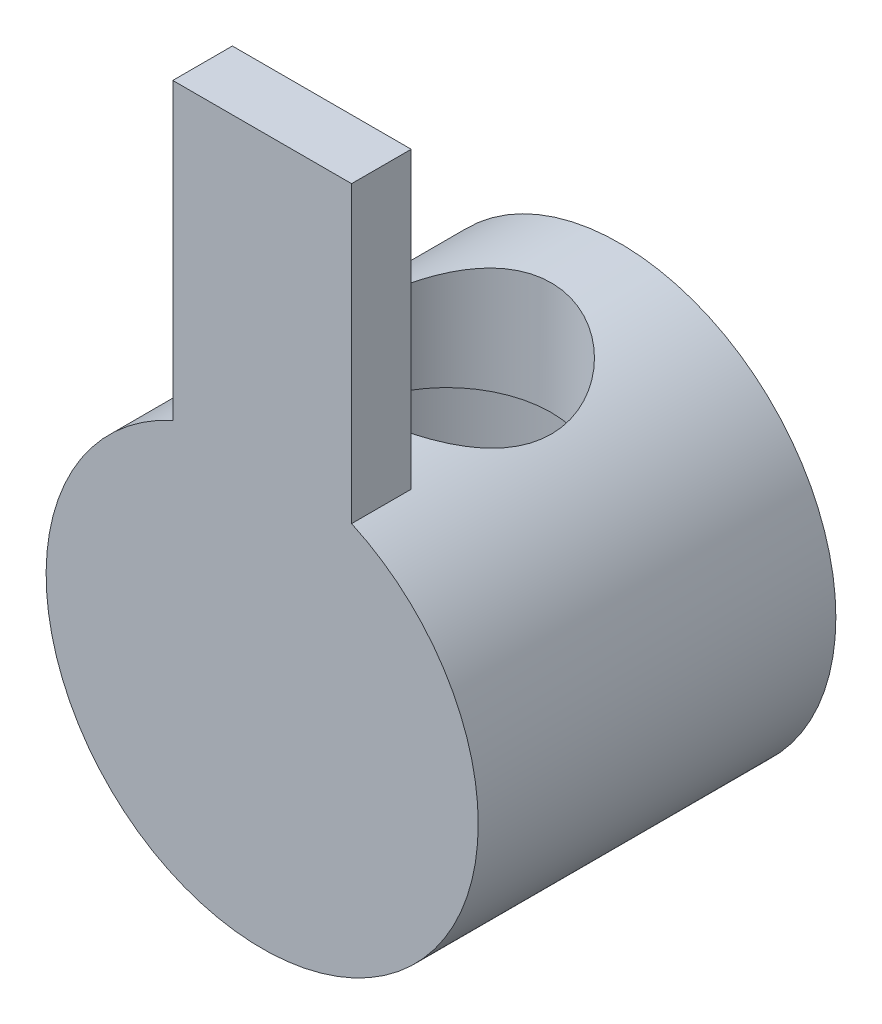
ISO-10303-21;
HEADER;
FILE_DESCRIPTION(('STEP AP214'),'2;1');
FILE_NAME('part.step','',(''),(''),'','','');
FILE_SCHEMA(('AUTOMOTIVE_DESIGN { 1 0 10303 214 1 1 1 1 }'));
ENDSEC;
DATA;
#1=APPLICATION_CONTEXT('core data for automotive mechanical design processes');
#2=APPLICATION_PROTOCOL_DEFINITION('international standard','automotive_design',2000,#1);
#3=PRODUCT_CONTEXT('',#1,'mechanical');
#4=PRODUCT('Part','Part','',(#3));
#5=PRODUCT_RELATED_PRODUCT_CATEGORY('part','',(#4));
#6=PRODUCT_DEFINITION_FORMATION('','',#4);
#7=PRODUCT_DEFINITION_CONTEXT('part definition',#1,'design');
#8=PRODUCT_DEFINITION('design','',#6,#7);
#9=PRODUCT_DEFINITION_SHAPE('','',#8);
#10=(LENGTH_UNIT() NAMED_UNIT(*) SI_UNIT(.MILLI.,.METRE.));
#11=(NAMED_UNIT(*) PLANE_ANGLE_UNIT() SI_UNIT($,.RADIAN.));
#12=(NAMED_UNIT(*) SI_UNIT($,.STERADIAN.) SOLID_ANGLE_UNIT());
#13=UNCERTAINTY_MEASURE_WITH_UNIT(LENGTH_MEASURE(1.E-05),#10,'distance_accuracy_value','');
#14=(GEOMETRIC_REPRESENTATION_CONTEXT(3) GLOBAL_UNCERTAINTY_ASSIGNED_CONTEXT((#13)) GLOBAL_UNIT_ASSIGNED_CONTEXT((#10,
#11,#12)) REPRESENTATION_CONTEXT('',''));
#15=CARTESIAN_POINT('',(0.,0.,0.));
#16=DIRECTION('',(0.,0.,1.));
#17=DIRECTION('',(1.,0.,0.));
#18=AXIS2_PLACEMENT_3D('',#15,#16,#17);
#19=CARTESIAN_POINT('',(0.,-4.98,-10.));
#20=DIRECTION('',(0.,0.,1.));
#21=DIRECTION('',(1.,0.,0.));
#22=AXIS2_PLACEMENT_3D('',#19,#20,#21);
#23=CYLINDRICAL_SURFACE('',#22,7.25);
#24=DIRECTION('',(0.,0.,1.));
#25=VECTOR('',#24,1.);
#26=CARTESIAN_POINT('',(3.,1.62018939122204,-10.));
#27=LINE('',#26,#25);
#28=CARTESIAN_POINT('',(3.,1.62018939122204,2.));
#29=VERTEX_POINT('',#28);
#30=CARTESIAN_POINT('',(3.,1.62018939122204,0.));
#31=VERTEX_POINT('',#30);
#32=EDGE_CURVE('E81',#29,#31,#27,.F.);
#33=ORIENTED_EDGE('',*,*,#32,.F.);
#34=CARTESIAN_POINT('',(0.,-4.98,2.));
#35=DIRECTION('',(0.,0.,1.));
#36=DIRECTION('',(1.,0.,0.));
#37=AXIS2_PLACEMENT_3D('',#34,#35,#36);
#38=CIRCLE('',#37,7.25);
#39=CARTESIAN_POINT('',(-3.,1.62018939122204,2.));
#40=VERTEX_POINT('',#39);
#41=EDGE_CURVE('E84',#40,#29,#38,.T.);
#42=ORIENTED_EDGE('',*,*,#41,.F.);
#43=DIRECTION('',(0.,0.,1.));
#44=VECTOR('',#43,1.);
#45=CARTESIAN_POINT('',(-3.,1.62018939122204,-10.));
#46=LINE('',#45,#44);
#47=CARTESIAN_POINT('',(-3.,1.62018939122204,0.));
#48=VERTEX_POINT('',#47);
#49=EDGE_CURVE('E87',#48,#40,#46,.T.);
#50=ORIENTED_EDGE('',*,*,#49,.F.);
#51=CARTESIAN_POINT('',(0.,-4.98,0.));
#52=DIRECTION('',(0.,0.,-1.));
#53=DIRECTION('',(-1.,0.,0.));
#54=AXIS2_PLACEMENT_3D('',#51,#52,#53);
#55=CIRCLE('',#54,7.25);
#56=EDGE_CURVE('E11',#48,#31,#55,.T.);
#57=ORIENTED_EDGE('',*,*,#56,.T.);
#58=EDGE_LOOP('',(#33,#42,#50,#57));
#59=FACE_BOUND('',#58,.T.);
#60=CARTESIAN_POINT('',(0.,-4.98,-10.));
#61=DIRECTION('',(0.,0.,1.));
#62=DIRECTION('',(1.,0.,0.));
#63=AXIS2_PLACEMENT_3D('',#60,#61,#62);
#64=CIRCLE('',#63,7.25);
#65=CARTESIAN_POINT('',(7.25,-4.98,-10.));
#66=VERTEX_POINT('',#65);
#67=EDGE_CURVE('E93',#66,#66,#64,.T.);
#68=ORIENTED_EDGE('',*,*,#67,.T.);
#69=EDGE_LOOP('',(#68));
#70=FACE_BOUND('',#69,.T.);
#71=CARTESIAN_POINT('',(0.,2.27,-0.7));
#72=CARTESIAN_POINT('',(0.0924197344090064,2.26999951625647,-0.700000562087777));
#73=CARTESIAN_POINT('',(0.184851700324278,2.26822836391737,-0.703665235258182));
#74=CARTESIAN_POINT('',(0.369038427453984,2.26118866138251,-0.718283050133746));
#75=CARTESIAN_POINT('',(0.460792842748421,2.2559184348274,-0.729239685325793));
#76=CARTESIAN_POINT('',(0.643048921020778,2.24200442372234,-0.758341536081696));
#77=CARTESIAN_POINT('',(0.733548377613047,2.23335532650045,-0.776498072888174));
#78=CARTESIAN_POINT('',(0.912511082504229,2.2129102642562,-0.819790567411884));
#79=CARTESIAN_POINT('',(1.00097348225918,2.20111301272506,-0.844929378641798));
#80=CARTESIAN_POINT('',(1.26165710014341,2.16152692403269,-0.930216880017036));
#81=CARTESIAN_POINT('',(1.43007650644369,2.12947059980974,-1.00038340120622));
#82=CARTESIAN_POINT('',(1.75243577391075,2.05696412991879,-1.16490605500397));
#83=CARTESIAN_POINT('',(1.90637743266883,2.0165150283227,-1.25925917911254));
#84=CARTESIAN_POINT('',(2.20549992600058,1.92825171152682,-1.47571056596515));
#85=CARTESIAN_POINT('',(2.34966743130444,1.88014767438869,-1.59909260993046));
#86=CARTESIAN_POINT('',(2.61616910656958,1.78301156085306,-1.86730144914759));
#87=CARTESIAN_POINT('',(2.73848784121281,1.73397885522262,-2.01214327378865));
#88=CARTESIAN_POINT('',(2.9665722803644,1.63652614436876,-2.33169393716601));
#89=CARTESIAN_POINT('',(3.07054593134531,1.58839685486165,-2.50779323550846));
#90=CARTESIAN_POINT('',(3.20280582467406,1.52437830169269,-2.78488481373494));
#91=CARTESIAN_POINT('',(3.24295215440778,1.50439584363518,-2.87944077638164));
#92=CARTESIAN_POINT('',(3.31494138858401,1.46789058534821,-3.07228793536087));
#93=CARTESIAN_POINT('',(3.34678905379882,1.45136580259861,-3.1705769528688));
#94=CARTESIAN_POINT('',(3.40019571444323,1.42328259591883,-3.36442134746372));
#95=CARTESIAN_POINT('',(3.42224035612938,1.41149354493502,-3.45980978773245));
#96=CARTESIAN_POINT('',(3.45829494118776,1.39205745108166,-3.65246585255564));
#97=CARTESIAN_POINT('',(3.47230901270318,1.38440828020448,-3.74973248498831));
#98=CARTESIAN_POINT('',(3.49210257020647,1.37356999069279,-3.94530559255865));
#99=CARTESIAN_POINT('',(3.49788626567557,1.37037859211603,-4.04361151020829));
#100=CARTESIAN_POINT('',(3.50115223830506,1.36857648409953,-4.24037117599865));
#101=CARTESIAN_POINT('',(3.49863521600532,1.36996538810471,-4.33882491096337));
#102=CARTESIAN_POINT('',(3.48011226982809,1.38015636914951,-4.61152040136846));
#103=CARTESIAN_POINT('',(3.45512748150764,1.39388960951479,-4.78506789227657));
#104=CARTESIAN_POINT('',(3.38005309921615,1.43400726185332,-5.125000475739));
#105=CARTESIAN_POINT('',(3.32995636440664,1.4603952722472,-5.29138351638671));
#106=CARTESIAN_POINT('',(3.20513883142098,1.52342689255621,-5.61711139319446));
#107=CARTESIAN_POINT('',(3.12987176899912,1.56029501900639,-5.77620209689284));
#108=CARTESIAN_POINT('',(2.95725477143714,1.64013394314775,-6.08022532401225));
#109=CARTESIAN_POINT('',(2.85989501281258,1.68310745240041,-6.22515150806254));
#110=CARTESIAN_POINT('',(2.6325387841291,1.77640631513003,-6.51461609579767));
#111=CARTESIAN_POINT('',(2.50005516991657,1.82700318262187,-6.65712032864966));
#112=CARTESIAN_POINT('',(2.21278698690098,1.92573246048187,-6.91870026481778));
#113=CARTESIAN_POINT('',(2.05799315338548,1.97386383570025,-7.03776618612366));
#114=CARTESIAN_POINT('',(1.72248977617807,2.06463582669973,-7.25358416530923));
#115=CARTESIAN_POINT('',(1.54098358591165,2.1069744439856,-7.34923491576218));
#116=CARTESIAN_POINT('',(1.16189027618242,2.17888365778159,-7.50789083805801));
#117=CARTESIAN_POINT('',(0.964315225712641,2.20846373361331,-7.57092025383579));
#118=CARTESIAN_POINT('',(0.575427178761533,2.24956137345064,-7.65765644097381));
#119=CARTESIAN_POINT('',(0.384851120965313,2.26232050167989,-7.68407465698647));
#120=CARTESIAN_POINT('',(0.0015704855468019,2.27252956279915,-7.70525137468312));
#121=CARTESIAN_POINT('',(-0.191133147335228,2.26998603783187,-7.70002340563987));
#122=CARTESIAN_POINT('',(-0.558652598555112,2.25062150468021,-7.65971802852813));
#123=CARTESIAN_POINT('',(-0.733765760668835,2.23482897947436,-7.62679038031963));
#124=CARTESIAN_POINT('',(-1.07566392597487,2.19183026494162,-7.53530723891361));
#125=CARTESIAN_POINT('',(-1.242447979602,2.16462277755391,-7.47674883106264));
#126=CARTESIAN_POINT('',(-1.56867622368486,2.10027110572829,-7.33399286309544));
#127=CARTESIAN_POINT('',(-1.72775279197647,2.06285459234176,-7.24908225496695));
#128=CARTESIAN_POINT('',(-2.02994882096989,1.98177602123535,-7.05681976053942));
#129=CARTESIAN_POINT('',(-2.1730612846635,1.93811124391574,-6.94945809282528));
#130=CARTESIAN_POINT('',(-2.45334289082279,1.84403400363376,-6.7037940074769));
#131=CARTESIAN_POINT('',(-2.58872429618118,1.79337154589652,-6.56354360610609));
#132=CARTESIAN_POINT('',(-2.8347732507603,1.69414400158029,-6.26202690872446));
#133=CARTESIAN_POINT('',(-2.94542653915999,1.6455801382248,-6.10074857025421));
#134=CARTESIAN_POINT('',(-3.14292960493586,1.55428079460178,-5.75352092992805));
#135=CARTESIAN_POINT('',(-3.22865771017454,1.51185391775164,-5.56684555333028));
#136=CARTESIAN_POINT('',(-3.36657111472758,1.44143212824369,-5.17899267852423));
#137=CARTESIAN_POINT('',(-3.41879657408118,1.41341994451633,-4.97783286607925));
#138=CARTESIAN_POINT('',(-3.48365513197375,1.37829256777328,-4.58687103552428));
#139=CARTESIAN_POINT('',(-3.4995294699332,1.36947053674869,-4.39776206708876));
#140=CARTESIAN_POINT('',(-3.50044930713568,1.3689662610773,-4.01947581699037));
#141=CARTESIAN_POINT('',(-3.48550545238527,1.37727809761231,-3.83029858148136));
#142=CARTESIAN_POINT('',(-3.42818880782964,1.40834281217462,-3.47376949844286));
#143=CARTESIAN_POINT('',(-3.38820164237417,1.42983661035602,-3.3059113385515));
#144=CARTESIAN_POINT('',(-3.28473991751539,1.48346331347726,-2.97941352118357));
#145=CARTESIAN_POINT('',(-3.22125814302187,1.5155994863239,-2.82077671287705));
#146=CARTESIAN_POINT('',(-3.06780407928735,1.58953439743495,-2.50549138276718));
#147=CARTESIAN_POINT('',(-2.97634033943088,1.63183673158473,-2.34969020960012));
#148=CARTESIAN_POINT('',(-2.77124491824015,1.72038561077047,-2.05465418369911));
#149=CARTESIAN_POINT('',(-2.65760223530799,1.76663410681855,-1.91542760800301));
#150=CARTESIAN_POINT('',(-2.39667306836182,1.86396969739019,-1.64156775285248));
#151=CARTESIAN_POINT('',(-2.2470582676029,1.91502783059325,-1.50913492652795));
#152=CARTESIAN_POINT('',(-1.926056329864,2.01148053226985,-1.27080150780442));
#153=CARTESIAN_POINT('',(-1.75465835424514,2.05687225887253,-1.16491420214408));
#154=CARTESIAN_POINT('',(-1.48449721372475,2.11699609149429,-1.02880360304943));
#155=CARTESIAN_POINT('',(-1.39219777976225,2.13572026326504,-0.987199236928428));
#156=CARTESIAN_POINT('',(-1.20384430533545,2.16999267078129,-0.91198808237127));
#157=CARTESIAN_POINT('',(-1.10779212819422,2.18554245939336,-0.878377382204291));
#158=CARTESIAN_POINT('',(-0.912870954342657,2.21297141660153,-0.819613908704564));
#159=CARTESIAN_POINT('',(-0.814008861622716,2.22485885382476,-0.794442071128671));
#160=CARTESIAN_POINT('',(-0.614125636788845,2.24463981626614,-0.752789738784914));
#161=CARTESIAN_POINT('',(-0.5131059248942,2.252535889133,-0.736303699672239));
#162=CARTESIAN_POINT('',(-0.343267758936794,2.26219170214062,-0.716196435736514));
#163=CARTESIAN_POINT('',(-0.274793917511191,2.26511573621254,-0.710126896599167));
#164=CARTESIAN_POINT('',(-0.137548980346633,2.26902008951613,-0.702028418909373));
#165=CARTESIAN_POINT('',(-0.0687778771955608,2.27000035999728,-0.699999581699684));
#166=CARTESIAN_POINT('',(0.,2.27,-0.7));
#167=B_SPLINE_CURVE_WITH_KNOTS('',3,(#71,#72,#73,#74,#75,#76,#77,#78,#79,#80,#81,#82,#83,#84,
#85,#86,#87,#88,#89,#90,#91,#92,#93,#94,#95,#96,#97,#98,#99,#100,#101,#102,#103,#104,#105,#106,
#107,#108,#109,#110,#111,#112,#113,#114,#115,#116,#117,#118,#119,#120,#121,#122,#123,#124,#125,
#126,#127,#128,#129,#130,#131,#132,#133,#134,#135,#136,#137,#138,#139,#140,#141,#142,#143,#144,
#145,#146,#147,#148,#149,#150,#151,#152,#153,#154,#155,#156,#157,#158,#159,#160,#161,#162,#163,
#164,#165,#166),.UNSPECIFIED.,.T.,.F.,(4,2,2,2,2,2,2,2,2,2,2,2,2,2,2,2,2,2,2,2,2,2,2,2,2,2,2,2,
2,2,2,2,2,2,2,2,2,2,2,2,2,2,2,2,2,2,2,4),(0.,0.277190779561934,0.554514453412982,
0.83227593574228,1.11015110095688,1.66318664600134,2.21615343394175,2.8009286038271,
3.38611527493435,4.01285329867772,4.32643963332247,4.6398456719221,4.93526187198635,
5.23052607575645,5.52563921031817,5.8207274394162,6.34564136107367,6.87070463211308,
7.40799529553673,7.94552533422464,8.5460232238765,9.14677120323059,9.77189266333227,
10.3965488682338,10.9718929174697,11.5469910148902,12.0811801575479,12.6154300623888,
13.1656248219585,13.7160597901317,14.3176383437117,14.9195629402578,15.5454259194192,
16.1705372599786,16.7372861445123,17.3038392809788,17.823253454085,18.3428272695145,
18.8972574932495,19.4519634376524,20.0678529685984,20.6840501559007,20.9925757557369,
21.3009500653111,21.6086229564098,21.9160992141535,22.1223767520317,22.3286594633851),.UNSPECIFIED.);
#168=CARTESIAN_POINT('',(0.,2.27,-0.7));
#169=VERTEX_POINT('',#168);
#170=EDGE_CURVE('E94',#169,#169,#167,.T.);
#171=ORIENTED_EDGE('',*,*,#170,.F.);
#172=EDGE_LOOP('',(#171));
#173=FACE_BOUND('',#172,.T.);
#174=CARTESIAN_POINT('',(0.,-12.23,-9.2));
#175=CARTESIAN_POINT('',(-0.124707365447508,-12.2300000045074,-9.20000000773032));
#176=CARTESIAN_POINT('',(-0.249414776255431,-12.2267755866717,-9.19532803208005));
#177=CARTESIAN_POINT('',(-0.497802636258185,-12.2139587226941,-9.17671619858997));
#178=CARTESIAN_POINT('',(-0.621483086411606,-12.2043662824969,-9.16277634940198));
#179=CARTESIAN_POINT('',(-0.866865548308617,-12.1790458782101,-9.12584430008295));
#180=CARTESIAN_POINT('',(-0.988567184643874,-12.1633167637351,-9.10285040266601));
#181=CARTESIAN_POINT('',(-1.22913749859048,-12.1260860830063,-9.04813856992388));
#182=CARTESIAN_POINT('',(-1.34800494028535,-12.1045820468356,-9.01641690161423));
#183=CARTESIAN_POINT('',(-1.58147202065318,-12.0564096502766,-8.94486780238016));
#184=CARTESIAN_POINT('',(-1.69609109811157,-12.0297695495095,-8.90508466870253));
#185=CARTESIAN_POINT('',(-1.9211343691283,-11.971800161077,-8.81777325860803));
#186=CARTESIAN_POINT('',(-2.03155690160736,-11.940469040355,-8.77024195387923));
#187=CARTESIAN_POINT('',(-2.35565955884968,-11.8403479439994,-8.61677793709575));
#188=CARTESIAN_POINT('',(-2.56237862225875,-11.7653865584404,-8.49991159700305));
#189=CARTESIAN_POINT('',(-2.97125505103695,-11.597197500727,-8.22951463512013));
#190=CARTESIAN_POINT('',(-3.17143802281698,-11.5029463961771,-8.07367361733959));
#191=CARTESIAN_POINT('',(-3.54473724377251,-11.3078508456777,-7.73530673963122));
#192=CARTESIAN_POINT('',(-3.71781266065275,-11.2069967715587,-7.55274140986908));
#193=CARTESIAN_POINT('',(-3.96913469199819,-11.0479954034937,-7.24426431264422));
#194=CARTESIAN_POINT('',(-4.05695763916772,-10.9894689311851,-7.12622470442001));
#195=CARTESIAN_POINT('',(-4.2222840113455,-10.8744866174718,-6.88217593257444));
#196=CARTESIAN_POINT('',(-4.29978486130115,-10.8180312952922,-6.75616479181688));
#197=CARTESIAN_POINT('',(-4.51579726807945,-10.654719820289,-6.36689769638949));
#198=CARTESIAN_POINT('',(-4.63832601468294,-10.5535808957307,-6.09178945926221));
#199=CARTESIAN_POINT('',(-4.80388310459135,-10.4107851954032,-5.60265965867914));
#200=CARTESIAN_POINT('',(-4.85975896940922,-10.360393969299,-5.39555722644186));
#201=CARTESIAN_POINT('',(-4.92350716410657,-10.3018770184824,-5.07792622458554));
#202=CARTESIAN_POINT('',(-4.94140929371512,-10.2852194466963,-4.97092839019408));
#203=CARTESIAN_POINT('',(-4.97026562385112,-10.2581968416857,-4.75523160758247));
#204=CARTESIAN_POINT('',(-4.98122242852199,-10.2478294500263,-4.64653331263163));
#205=CARTESIAN_POINT('',(-4.99602749686114,-10.2337903836384,-4.42762119138112));
#206=CARTESIAN_POINT('',(-4.99983666794842,-10.2301555326084,-4.31740233287728));
#207=CARTESIAN_POINT('',(-5.0001530395897,-10.2298542701958,-4.09694511047784));
#208=CARTESIAN_POINT('',(-4.99666024970233,-10.2331878496911,-3.98670674660796));
#209=CARTESIAN_POINT('',(-4.98243796743525,-10.2466790112805,-3.76707442613195));
#210=CARTESIAN_POINT('',(-4.97170547060903,-10.2568394264744,-3.65768083917566));
#211=CARTESIAN_POINT('',(-4.94320701136023,-10.2835438596528,-3.44058551295944));
#212=CARTESIAN_POINT('',(-4.92543809626122,-10.3000905574248,-3.33288450370312));
#213=CARTESIAN_POINT('',(-4.86451340017346,-10.3560548169202,-3.02605450855591));
#214=CARTESIAN_POINT('',(-4.81277867555868,-10.4027836482482,-2.8298934020129));
#215=CARTESIAN_POINT('',(-4.68769333563208,-10.5112581379366,-2.44904399621847));
#216=CARTESIAN_POINT('',(-4.61432572304214,-10.5730155978212,-2.26436485719988));
#217=CARTESIAN_POINT('',(-4.46840470952065,-10.6898459573366,-1.95157811584981));
#218=CARTESIAN_POINT('',(-4.40005317631329,-10.742851287919,-1.82069339943718));
#219=CARTESIAN_POINT('',(-4.25281227219442,-10.8523504521232,-1.56653096917303));
#220=CARTESIAN_POINT('',(-4.17392253897074,-10.9088444056508,-1.44325351707878));
#221=CARTESIAN_POINT('',(-4.00593581273484,-11.0236205617588,-1.20436285289545));
#222=CARTESIAN_POINT('',(-3.91681969378179,-11.0819059607594,-1.08876466179929));
#223=CARTESIAN_POINT('',(-3.72887194346622,-11.1985404349556,-0.865818409166073));
#224=CARTESIAN_POINT('',(-3.63004150124841,-11.2568895014949,-0.758469340701063));
#225=CARTESIAN_POINT('',(-3.4218883051479,-11.3727706168462,-0.551376341730058));
#226=CARTESIAN_POINT('',(-3.31246778607984,-11.4302880172784,-0.451722341042431));
#227=CARTESIAN_POINT('',(-3.08434050108664,-11.5424305202892,-0.261871233394489));
#228=CARTESIAN_POINT('',(-2.96563490843682,-11.5970559868388,-0.171672934957985));
#229=CARTESIAN_POINT('',(-2.71954034374921,-11.7019388180314,-0.00161554523004807));
#230=CARTESIAN_POINT('',(-2.59216637136548,-11.7522034021689,0.0782607459192534));
#231=CARTESIAN_POINT('',(-2.32914285665014,-11.8471043328957,0.226951226904318));
#232=CARTESIAN_POINT('',(-2.19349581809477,-11.8917423698946,0.295768740896106));
#233=CARTESIAN_POINT('',(-1.94566927113531,-11.9649603212021,0.407442707548162));
#234=CARTESIAN_POINT('',(-1.83495658100191,-11.9949060778806,0.452671987696643));
#235=CARTESIAN_POINT('',(-1.6095298562079,-12.0500331547583,0.535379630532579));
#236=CARTESIAN_POINT('',(-1.49481662261523,-12.0752154223831,0.572859534656766));
#237=CARTESIAN_POINT('',(-1.26203684055261,-12.1202950704758,0.639619801444246));
#238=CARTESIAN_POINT('',(-1.14397107904853,-12.1401936800512,0.668902071162937));
#239=CARTESIAN_POINT('',(-0.905273942577357,-12.1742688611479,0.718875758678831));
#240=CARTESIAN_POINT('',(-0.78464377915778,-12.1884480742079,0.739571142508974));
#241=CARTESIAN_POINT('',(-0.541127752731092,-12.2108154143192,0.772155755284704));
#242=CARTESIAN_POINT('',(-0.418234575698596,-12.2189782856484,0.784007863994002));
#243=CARTESIAN_POINT('',(-0.17169674252636,-12.2290160904699,0.798576022071974));
#244=CARTESIAN_POINT('',(-0.0480523896498806,-12.2308934118684,0.801295540950208));
#245=CARTESIAN_POINT('',(0.199056294653482,-12.228320284795,0.797564285119163));
#246=CARTESIAN_POINT('',(0.32252058436182,-12.2238685495391,0.791111645584437));
#247=CARTESIAN_POINT('',(0.568247670673675,-12.2087446186393,0.769135937470111));
#248=CARTESIAN_POINT('',(0.690510502841951,-12.1980726076915,0.753613138206834));
#249=CARTESIAN_POINT('',(0.925730861833421,-12.1715705583416,0.714913443309046));
#250=CARTESIAN_POINT('',(1.03881094618708,-12.1560830646101,0.692243758473169));
#251=CARTESIAN_POINT('',(1.26240501291379,-12.1201456680067,0.639375075066754));
#252=CARTESIAN_POINT('',(1.37291815204371,-12.0996941590238,0.609173639505344));
#253=CARTESIAN_POINT('',(1.69959635039116,-12.0314695519042,0.507787187362797));
#254=CARTESIAN_POINT('',(1.91108190736786,-11.9768050011065,0.425789468437276));
#255=CARTESIAN_POINT('',(2.33291296739471,-11.848215191033,0.228978067505943));
#256=CARTESIAN_POINT('',(2.54194687863821,-11.7731407406458,0.11214191008493));
#257=CARTESIAN_POINT('',(2.93827730674712,-11.6113571247276,-0.147505460295717));
#258=CARTESIAN_POINT('',(3.12555848770119,-11.5246398426238,-0.290334818823953));
#259=CARTESIAN_POINT('',(3.50648856741728,-11.3298185882529,-0.625178551572854));
#260=CARTESIAN_POINT('',(3.69583680364175,-11.2205808908297,-0.821426254116447));
#261=CARTESIAN_POINT('',(4.04065906969768,-11.0030495496867,-1.24243677948434));
#262=CARTESIAN_POINT('',(4.19611239689294,-10.8947565215053,-1.46721689773524));
#263=CARTESIAN_POINT('',(4.45377022577178,-10.7026807900615,-1.91475363301554));
#264=CARTESIAN_POINT('',(4.56012668608593,-10.6175163258655,-2.134514191372));
#265=CARTESIAN_POINT('',(4.74103097669989,-10.466262971594,-2.59282096431167));
#266=CARTESIAN_POINT('',(4.81564137148947,-10.4001366455444,-2.83132912151942));
#267=CARTESIAN_POINT('',(4.91861107242801,-10.3067000483565,-3.27815710732194));
#268=CARTESIAN_POINT('',(4.95292087849522,-10.2745123829643,-3.4840583986484));
#269=CARTESIAN_POINT('',(4.99541998322001,-10.2344455728966,-3.90079908689942));
#270=CARTESIAN_POINT('',(5.00363753915871,-10.226540131458,-4.11163289249308));
#271=CARTESIAN_POINT('',(4.99339225387513,-10.2362878356403,-4.53207866972753));
#272=CARTESIAN_POINT('',(4.97492290057247,-10.253947219535,-4.74169033061049));
#273=CARTESIAN_POINT('',(4.91259996625266,-10.3120365337114,-5.15393394054127));
#274=CARTESIAN_POINT('',(4.86870985308454,-10.3524992323533,-5.35655539901566));
#275=CARTESIAN_POINT('',(4.74096532833847,-10.4658891266407,-5.81075495334534));
#276=CARTESIAN_POINT('',(4.64902527421817,-10.544941768675,-6.05853138628597));
#277=CARTESIAN_POINT('',(4.48543238156075,-10.6763423529203,-6.41312974734276));
#278=CARTESIAN_POINT('',(4.42653900014266,-10.7223393387516,-6.52860684554601));
#279=CARTESIAN_POINT('',(4.30057994610258,-10.8172718334377,-6.7537486208568));
#280=CARTESIAN_POINT('',(4.23351472399854,-10.8662071802236,-6.86341361791069));
#281=CARTESIAN_POINT('',(4.01743590115974,-11.0177128448724,-7.18810850733372));
#282=CARTESIAN_POINT('',(3.85588696235309,-11.123006901415,-7.39377764921678));
#283=CARTESIAN_POINT('',(3.59079986097214,-11.2791473819875,-7.68183856824053));
#284=CARTESIAN_POINT('',(3.4985973700237,-11.3309167789699,-7.77448847121983));
#285=CARTESIAN_POINT('',(3.30669568403764,-11.4329102441818,-7.95272016821784));
#286=CARTESIAN_POINT('',(3.20699470704405,-11.4831339410665,-8.03830027195082));
#287=CARTESIAN_POINT('',(2.98445797199536,-11.5885488055225,-8.21449067364709));
#288=CARTESIAN_POINT('',(2.86042349687638,-11.6433145092805,-8.30384732582006));
#289=CARTESIAN_POINT('',(2.60326617583248,-11.7479212927638,-8.47159864273718));
#290=CARTESIAN_POINT('',(2.47014760189066,-11.7977646606959,-8.54999840802579));
#291=CARTESIAN_POINT('',(2.19559165793308,-11.8910691274781,-8.69482364718478));
#292=CARTESIAN_POINT('',(2.0541629655786,-11.934536723855,-8.76126132751135));
#293=CARTESIAN_POINT('',(1.76386309630001,-12.0137682846192,-8.88117758265499));
#294=CARTESIAN_POINT('',(1.61499477956829,-12.0495351819211,-8.93466109221536));
#295=CARTESIAN_POINT('',(1.34616843640148,-12.1049278040884,-9.01692753041073));
#296=CARTESIAN_POINT('',(1.22744983155253,-12.126373818112,-9.04856234248174));
#297=CARTESIAN_POINT('',(0.987156352777793,-12.1635082279147,-9.10313081574267));
#298=CARTESIAN_POINT('',(0.865582108292109,-12.1791978800719,-9.12606637566006));
#299=CARTESIAN_POINT('',(0.620518730391699,-12.2044460530686,-9.16289233120265));
#300=CARTESIAN_POINT('',(0.497030864317394,-12.2140084678317,-9.17678847155915));
#301=CARTESIAN_POINT('',(0.249028702438353,-12.2267855408813,-9.19534245030447));
#302=CARTESIAN_POINT('',(0.12451437382924,-12.2299999954996,-9.19999999228165));
#303=CARTESIAN_POINT('',(0.,-12.23,-9.2));
#304=B_SPLINE_CURVE_WITH_KNOTS('',3,(#174,#175,#176,#177,#178,#179,#180,#181,#182,#183,#184,
#185,#186,#187,#188,#189,#190,#191,#192,#193,#194,#195,#196,#197,#198,#199,#200,#201,#202,#203,
#204,#205,#206,#207,#208,#209,#210,#211,#212,#213,#214,#215,#216,#217,#218,#219,#220,#221,#222,
#223,#224,#225,#226,#227,#228,#229,#230,#231,#232,#233,#234,#235,#236,#237,#238,#239,#240,#241,
#242,#243,#244,#245,#246,#247,#248,#249,#250,#251,#252,#253,#254,#255,#256,#257,#258,#259,#260,
#261,#262,#263,#264,#265,#266,#267,#268,#269,#270,#271,#272,#273,#274,#275,#276,#277,#278,#279,
#280,#281,#282,#283,#284,#285,#286,#287,#288,#289,#290,#291,#292,#293,#294,#295,#296,#297,#298,
#299,#300,#301,#302,#303),.UNSPECIFIED.,.T.,.F.,(4,2,2,2,2,2,2,2,2,2,2,2,2,2,2,2,2,2,2,2,2,2,2,
2,2,2,2,2,2,2,2,2,2,2,2,2,2,2,2,2,2,2,2,2,2,2,2,2,2,2,2,2,2,2,2,2,2,2,2,2,2,2,2,2,4),(0.,
0.373994227033261,0.747988104932516,1.12205212570652,1.49627638805501,1.86849751089914,
2.24086446380315,2.98495168715124,3.79401037874018,4.60427627729147,5.0787856788919,
5.55341323546064,6.50009495833225,7.15840613487806,7.48731140006538,7.81609326945467,
8.14666816396014,8.47724262572615,8.80795435890585,9.13880501521771,9.76087448954358,
10.3834340413951,10.853511539299,11.3236052030238,11.7945928484567,12.2655229112257,
12.7413135410056,13.2170441460181,13.6919715147562,14.1667558570344,14.536249489634,
14.9056695550006,15.2750036088381,15.6441668876134,16.0148711684225,16.3854346011634,
16.7560733853031,17.1267011647852,17.4754000225754,17.8242118529021,18.5212852969658,
19.2714076286767,20.0220556353743,20.8999300099715,21.7783390877692,22.5513044842834,
23.3227394003927,23.9536034592537,24.5837840740307,25.2141184900546,25.8453610146725,
26.6681522509412,27.0804902720236,27.4928055709666,28.3350232692528,28.756507984316,
29.1780931803171,29.6645763581866,30.1508323133503,30.6365892314882,31.122160814018,
31.4958835899451,31.8695247489019,32.2429282188637,32.6163436689271),.UNSPECIFIED.);
#305=CARTESIAN_POINT('',(0.,-12.23,-9.2));
#306=VERTEX_POINT('',#305);
#307=EDGE_CURVE('E37',#306,#306,#304,.T.);
#308=ORIENTED_EDGE('',*,*,#307,.T.);
#309=EDGE_LOOP('',(#308));
#310=FACE_BOUND('',#309,.T.);
#311=ADVANCED_FACE('F33',(#59,#70,#173,#310),#23,.T.);
#312=CARTESIAN_POINT('',(3.,-11.5,2.));
#313=DIRECTION('',(-1.,0.,0.));
#314=DIRECTION('',(0.,0.,1.));
#315=AXIS2_PLACEMENT_3D('',#312,#313,#314);
#316=PLANE('',#315);
#317=DIRECTION('',(0.,1.,0.));
#318=VECTOR('',#317,1.);
#319=CARTESIAN_POINT('',(3.,-11.5,2.));
#320=LINE('',#319,#318);
#321=CARTESIAN_POINT('',(3.,11.5,2.));
#322=VERTEX_POINT('',#321);
#323=EDGE_CURVE('E90',#29,#322,#320,.T.);
#324=ORIENTED_EDGE('',*,*,#323,.F.);
#325=ORIENTED_EDGE('',*,*,#32,.T.);
#326=DIRECTION('',(0.,1.,0.));
#327=VECTOR('',#326,1.);
#328=CARTESIAN_POINT('',(3.,-11.5,0.));
#329=LINE('',#328,#327);
#330=CARTESIAN_POINT('',(3.,11.5,0.));
#331=VERTEX_POINT('',#330);
#332=EDGE_CURVE('E67',#31,#331,#329,.T.);
#333=ORIENTED_EDGE('',*,*,#332,.T.);
#334=DIRECTION('',(0.,0.,-1.));
#335=VECTOR('',#334,1.);
#336=CARTESIAN_POINT('',(3.,11.5,2.));
#337=LINE('',#336,#335);
#338=EDGE_CURVE('E47',#322,#331,#337,.T.);
#339=ORIENTED_EDGE('',*,*,#338,.F.);
#340=EDGE_LOOP('',(#324,#325,#333,#339));
#341=FACE_BOUND('',#340,.T.);
#342=ADVANCED_FACE('F35',(#341),#316,.F.);
#343=CARTESIAN_POINT('',(-3.,11.5,2.));
#344=DIRECTION('',(0.,-1.,0.));
#345=DIRECTION('',(0.,0.,-1.));
#346=AXIS2_PLACEMENT_3D('',#343,#344,#345);
#347=PLANE('',#346);
#348=DIRECTION('',(-1.,0.,0.));
#349=VECTOR('',#348,1.);
#350=CARTESIAN_POINT('',(-3.,11.5,0.));
#351=LINE('',#350,#349);
#352=CARTESIAN_POINT('',(-3.,11.5,0.));
#353=VERTEX_POINT('',#352);
#354=EDGE_CURVE('E101',#331,#353,#351,.T.);
#355=ORIENTED_EDGE('',*,*,#354,.T.);
#356=DIRECTION('',(0.,0.,-1.));
#357=VECTOR('',#356,1.);
#358=CARTESIAN_POINT('',(-3.,11.5,2.));
#359=LINE('',#358,#357);
#360=CARTESIAN_POINT('',(-3.,11.5,2.));
#361=VERTEX_POINT('',#360);
#362=EDGE_CURVE('E106',#361,#353,#359,.T.);
#363=ORIENTED_EDGE('',*,*,#362,.F.);
#364=DIRECTION('',(-1.,0.,0.));
#365=VECTOR('',#364,1.);
#366=CARTESIAN_POINT('',(-3.,11.5,2.));
#367=LINE('',#366,#365);
#368=EDGE_CURVE('E56',#322,#361,#367,.T.);
#369=ORIENTED_EDGE('',*,*,#368,.F.);
#370=ORIENTED_EDGE('',*,*,#338,.T.);
#371=EDGE_LOOP('',(#355,#363,#369,#370));
#372=FACE_BOUND('',#371,.T.);
#373=ADVANCED_FACE('F142',(#372),#347,.F.);
#374=CARTESIAN_POINT('',(-3.,-11.5,2.));
#375=DIRECTION('',(1.,0.,0.));
#376=DIRECTION('',(0.,0.,-1.));
#377=AXIS2_PLACEMENT_3D('',#374,#375,#376);
#378=PLANE('',#377);
#379=DIRECTION('',(0.,-1.,0.));
#380=VECTOR('',#379,1.);
#381=CARTESIAN_POINT('',(-3.,-11.5,0.));
#382=LINE('',#381,#380);
#383=EDGE_CURVE('E97',#353,#48,#382,.T.);
#384=ORIENTED_EDGE('',*,*,#383,.T.);
#385=ORIENTED_EDGE('',*,*,#49,.T.);
#386=DIRECTION('',(0.,-1.,0.));
#387=VECTOR('',#386,1.);
#388=CARTESIAN_POINT('',(-3.,-11.5,2.));
#389=LINE('',#388,#387);
#390=EDGE_CURVE('E92',#361,#40,#389,.T.);
#391=ORIENTED_EDGE('',*,*,#390,.F.);
#392=ORIENTED_EDGE('',*,*,#362,.T.);
#393=EDGE_LOOP('',(#384,#385,#391,#392));
#394=FACE_BOUND('',#393,.T.);
#395=ADVANCED_FACE('F146',(#394),#378,.F.);
#396=CARTESIAN_POINT('',(3.,11.5,2.));
#397=DIRECTION('',(0.,0.,-1.));
#398=DIRECTION('',(-1.,0.,0.));
#399=AXIS2_PLACEMENT_3D('',#396,#397,#398);
#400=PLANE('',#399);
#401=ORIENTED_EDGE('',*,*,#41,.T.);
#402=ORIENTED_EDGE('',*,*,#323,.T.);
#403=ORIENTED_EDGE('',*,*,#368,.T.);
#404=ORIENTED_EDGE('',*,*,#390,.T.);
#405=EDGE_LOOP('',(#401,#402,#403,#404));
#406=FACE_BOUND('',#405,.T.);
#407=ADVANCED_FACE('F89',(#406),#400,.F.);
#408=CARTESIAN_POINT('',(3.,11.5,0.));
#409=DIRECTION('',(0.,0.,-1.));
#410=DIRECTION('',(-1.,0.,0.));
#411=AXIS2_PLACEMENT_3D('',#408,#409,#410);
#412=PLANE('',#411);
#413=ORIENTED_EDGE('',*,*,#56,.F.);
#414=ORIENTED_EDGE('',*,*,#383,.F.);
#415=ORIENTED_EDGE('',*,*,#354,.F.);
#416=ORIENTED_EDGE('',*,*,#332,.F.);
#417=EDGE_LOOP('',(#413,#414,#415,#416));
#418=FACE_BOUND('',#417,.T.);
#419=ADVANCED_FACE('F130',(#418),#412,.T.);
#420=CARTESIAN_POINT('',(0.,-4.98,-10.));
#421=DIRECTION('',(0.,0.,1.));
#422=DIRECTION('',(1.,0.,0.));
#423=AXIS2_PLACEMENT_3D('',#420,#421,#422);
#424=PLANE('',#423);
#425=ORIENTED_EDGE('',*,*,#67,.F.);
#426=EDGE_LOOP('',(#425));
#427=FACE_BOUND('',#426,.T.);
#428=ADVANCED_FACE('F124',(#427),#424,.F.);
#429=CARTESIAN_POINT('',(0.,-12.23,-4.2));
#430=DIRECTION('',(0.,1.,0.));
#431=DIRECTION('',(0.,0.,1.));
#432=AXIS2_PLACEMENT_3D('',#429,#430,#431);
#433=CYLINDRICAL_SURFACE('',#432,3.5);
#434=CARTESIAN_POINT('',(0.,-1.5,-4.2));
#435=DIRECTION('',(0.,1.,0.));
#436=DIRECTION('',(0.,0.,1.));
#437=AXIS2_PLACEMENT_3D('',#434,#435,#436);
#438=CIRCLE('',#437,3.5);
#439=CARTESIAN_POINT('',(0.,-1.5,-0.7));
#440=VERTEX_POINT('',#439);
#441=EDGE_CURVE('E116',#440,#440,#438,.F.);
#442=ORIENTED_EDGE('',*,*,#441,.T.);
#443=EDGE_LOOP('',(#442));
#444=FACE_BOUND('',#443,.T.);
#445=ORIENTED_EDGE('',*,*,#170,.T.);
#446=EDGE_LOOP('',(#445));
#447=FACE_BOUND('',#446,.T.);
#448=ADVANCED_FACE('F120',(#444,#447),#433,.F.);
#449=CARTESIAN_POINT('',(0.,-1.5,-4.2));
#450=DIRECTION('',(0.,1.,0.));
#451=DIRECTION('',(0.,0.,1.));
#452=AXIS2_PLACEMENT_3D('',#449,#450,#451);
#453=PLANE('',#452);
#454=CARTESIAN_POINT('',(0.,-1.5,-4.2));
#455=DIRECTION('',(0.,1.,0.));
#456=DIRECTION('',(0.,0.,1.));
#457=AXIS2_PLACEMENT_3D('',#454,#455,#456);
#458=CIRCLE('',#457,5.);
#459=CARTESIAN_POINT('',(0.,-1.5,0.8));
#460=VERTEX_POINT('',#459);
#461=EDGE_CURVE('E202',#460,#460,#458,.T.);
#462=ORIENTED_EDGE('',*,*,#461,.F.);
#463=EDGE_LOOP('',(#462));
#464=FACE_BOUND('',#463,.T.);
#465=ORIENTED_EDGE('',*,*,#441,.F.);
#466=EDGE_LOOP('',(#465));
#467=FACE_BOUND('',#466,.T.);
#468=ADVANCED_FACE('F123',(#464,#467),#453,.F.);
#469=CARTESIAN_POINT('',(0.,-1.5,-4.2));
#470=DIRECTION('',(0.,-1.,0.));
#471=DIRECTION('',(0.,0.,-1.));
#472=AXIS2_PLACEMENT_3D('',#469,#470,#471);
#473=CYLINDRICAL_SURFACE('',#472,5.);
#474=ORIENTED_EDGE('',*,*,#307,.F.);
#475=EDGE_LOOP('',(#474));
#476=FACE_BOUND('',#475,.T.);
#477=ORIENTED_EDGE('',*,*,#461,.T.);
#478=EDGE_LOOP('',(#477));
#479=FACE_BOUND('',#478,.T.);
#480=ADVANCED_FACE('F126',(#476,#479),#473,.F.);
#481=CLOSED_SHELL('',(#311,#342,#373,#395,#407,#419,#428,#448,#468,#480));
#482=MANIFOLD_SOLID_BREP('B2',#481);
#483=ADVANCED_BREP_SHAPE_REPRESENTATION('',(#18,#482),#14);
#484=SHAPE_DEFINITION_REPRESENTATION(#9,#483);
ENDSEC;
END-ISO-10303-21;
